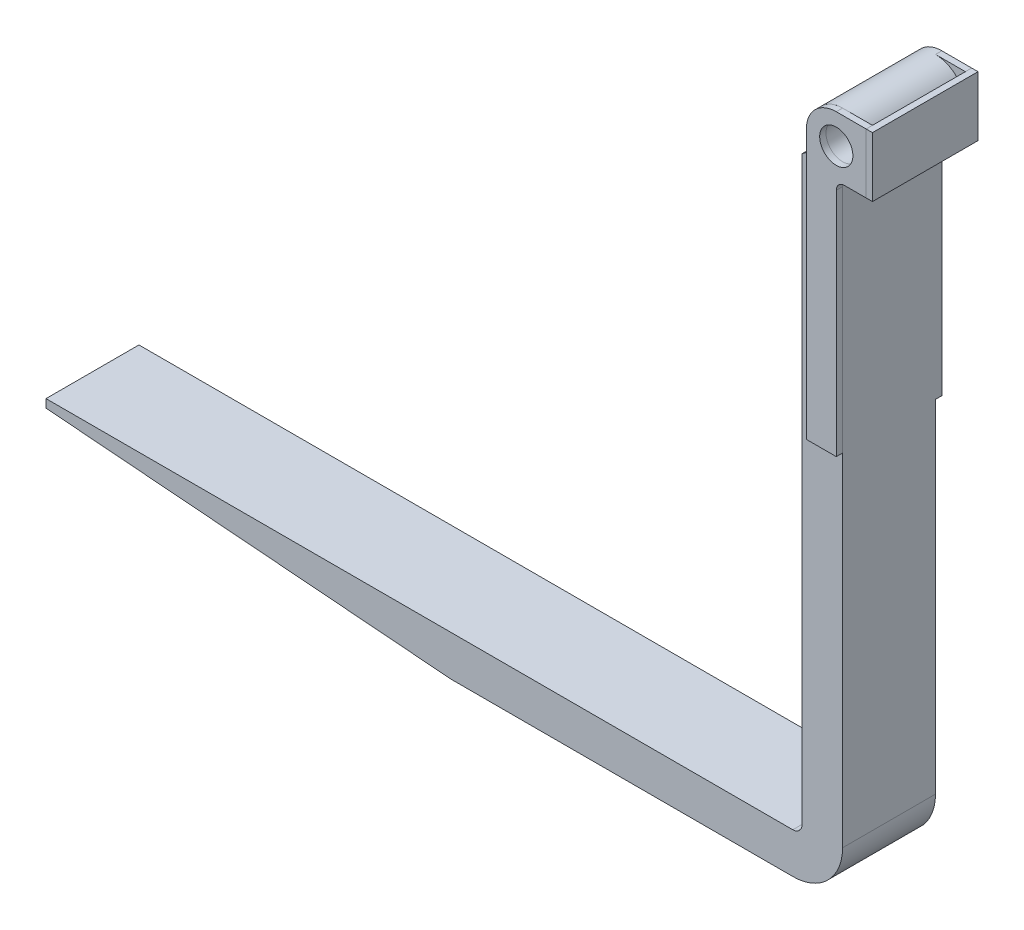
ISO-10303-21;
HEADER;
FILE_DESCRIPTION(('STEP AP214'),'2;1');
FILE_NAME('part.step','',(''),(''),'','','');
FILE_SCHEMA(('AUTOMOTIVE_DESIGN { 1 0 10303 214 1 1 1 1 }'));
ENDSEC;
DATA;
#1=APPLICATION_CONTEXT('core data for automotive mechanical design processes');
#2=APPLICATION_PROTOCOL_DEFINITION('international standard','automotive_design',2000,#1);
#3=PRODUCT_CONTEXT('',#1,'mechanical');
#4=PRODUCT('Part','Part','',(#3));
#5=PRODUCT_RELATED_PRODUCT_CATEGORY('part','',(#4));
#6=PRODUCT_DEFINITION_FORMATION('','',#4);
#7=PRODUCT_DEFINITION_CONTEXT('part definition',#1,'design');
#8=PRODUCT_DEFINITION('design','',#6,#7);
#9=PRODUCT_DEFINITION_SHAPE('','',#8);
#10=(LENGTH_UNIT() NAMED_UNIT(*) SI_UNIT(.MILLI.,.METRE.));
#11=(NAMED_UNIT(*) PLANE_ANGLE_UNIT() SI_UNIT($,.RADIAN.));
#12=(NAMED_UNIT(*) SI_UNIT($,.STERADIAN.) SOLID_ANGLE_UNIT());
#13=UNCERTAINTY_MEASURE_WITH_UNIT(LENGTH_MEASURE(1.E-05),#10,'distance_accuracy_value','');
#14=(GEOMETRIC_REPRESENTATION_CONTEXT(3) GLOBAL_UNCERTAINTY_ASSIGNED_CONTEXT((#13)) GLOBAL_UNIT_ASSIGNED_CONTEXT((#10,
#11,#12)) REPRESENTATION_CONTEXT('',''));
#15=CARTESIAN_POINT('',(0.,0.,0.));
#16=DIRECTION('',(0.,0.,1.));
#17=DIRECTION('',(1.,0.,0.));
#18=AXIS2_PLACEMENT_3D('',#15,#16,#17);
#19=CARTESIAN_POINT('',(54.5,950.,79.5));
#20=DIRECTION('',(0.,0.,-1.));
#21=DIRECTION('',(-1.,0.,0.));
#22=AXIS2_PLACEMENT_3D('',#19,#20,#21);
#23=PLANE('',#22);
#24=DIRECTION('',(0.,-1.,0.));
#25=VECTOR('',#24,1.);
#26=CARTESIAN_POINT('',(45.,950.,79.5));
#27=LINE('',#26,#25);
#28=CARTESIAN_POINT('',(45.,1040.,79.5));
#29=VERTEX_POINT('',#28);
#30=CARTESIAN_POINT('',(45.,950.,79.5));
#31=VERTEX_POINT('',#30);
#32=EDGE_CURVE('E117',#29,#31,#27,.T.);
#33=ORIENTED_EDGE('',*,*,#32,.T.);
#34=DIRECTION('',(-1.,0.,0.));
#35=VECTOR('',#34,1.);
#36=CARTESIAN_POINT('',(54.5,950.,79.5));
#37=LINE('',#36,#35);
#38=CARTESIAN_POINT('',(54.5,950.,79.5));
#39=VERTEX_POINT('',#38);
#40=EDGE_CURVE('E12',#39,#31,#37,.T.);
#41=ORIENTED_EDGE('',*,*,#40,.F.);
#42=DIRECTION('',(0.,-1.,0.));
#43=VECTOR('',#42,1.);
#44=CARTESIAN_POINT('',(54.5,950.,79.5));
#45=LINE('',#44,#43);
#46=CARTESIAN_POINT('',(54.5,1040.,79.5));
#47=VERTEX_POINT('',#46);
#48=EDGE_CURVE('E105',#47,#39,#45,.T.);
#49=ORIENTED_EDGE('',*,*,#48,.F.);
#50=DIRECTION('',(-1.,0.,0.));
#51=VECTOR('',#50,1.);
#52=CARTESIAN_POINT('',(54.5,1040.,79.5));
#53=LINE('',#52,#51);
#54=EDGE_CURVE('E113',#47,#29,#53,.T.);
#55=ORIENTED_EDGE('',*,*,#54,.T.);
#56=EDGE_LOOP('',(#33,#41,#49,#55));
#57=FACE_BOUND('',#56,.T.);
#58=ADVANCED_FACE('F54',(#57),#23,.F.);
#59=CARTESIAN_POINT('',(54.5,950.,79.5));
#60=DIRECTION('',(0.,1.,0.));
#61=DIRECTION('',(0.,0.,1.));
#62=AXIS2_PLACEMENT_3D('',#59,#60,#61);
#63=PLANE('',#62);
#64=DIRECTION('',(0.,0.,-1.));
#65=VECTOR('',#64,1.);
#66=CARTESIAN_POINT('',(45.,950.,79.5));
#67=LINE('',#66,#65);
#68=CARTESIAN_POINT('',(45.,950.,-79.5));
#69=VERTEX_POINT('',#68);
#70=EDGE_CURVE('E109',#31,#69,#67,.T.);
#71=ORIENTED_EDGE('',*,*,#70,.T.);
#72=DIRECTION('',(-1.,0.,0.));
#73=VECTOR('',#72,1.);
#74=CARTESIAN_POINT('',(54.5,950.,-79.5));
#75=LINE('',#74,#73);
#76=CARTESIAN_POINT('',(54.5,950.,-79.5));
#77=VERTEX_POINT('',#76);
#78=EDGE_CURVE('E62',#77,#69,#75,.T.);
#79=ORIENTED_EDGE('',*,*,#78,.F.);
#80=DIRECTION('',(0.,0.,-1.));
#81=VECTOR('',#80,1.);
#82=CARTESIAN_POINT('',(54.5,950.,79.5));
#83=LINE('',#82,#81);
#84=EDGE_CURVE('E100',#39,#77,#83,.T.);
#85=ORIENTED_EDGE('',*,*,#84,.F.);
#86=ORIENTED_EDGE('',*,*,#40,.T.);
#87=EDGE_LOOP('',(#71,#79,#85,#86));
#88=FACE_BOUND('',#87,.T.);
#89=ADVANCED_FACE('F108',(#88),#63,.F.);
#90=CARTESIAN_POINT('',(54.5,950.,-79.5));
#91=DIRECTION('',(0.,0.,1.));
#92=DIRECTION('',(1.,0.,0.));
#93=AXIS2_PLACEMENT_3D('',#90,#91,#92);
#94=PLANE('',#93);
#95=DIRECTION('',(0.,1.,0.));
#96=VECTOR('',#95,1.);
#97=CARTESIAN_POINT('',(45.,950.,-79.5));
#98=LINE('',#97,#96);
#99=CARTESIAN_POINT('',(45.,1040.,-79.5));
#100=VERTEX_POINT('',#99);
#101=EDGE_CURVE('E87',#69,#100,#98,.T.);
#102=ORIENTED_EDGE('',*,*,#101,.T.);
#103=DIRECTION('',(-1.,0.,0.));
#104=VECTOR('',#103,1.);
#105=CARTESIAN_POINT('',(54.5,1040.,-79.5));
#106=LINE('',#105,#104);
#107=CARTESIAN_POINT('',(54.5,1040.,-79.5));
#108=VERTEX_POINT('',#107);
#109=EDGE_CURVE('E110',#108,#100,#106,.T.);
#110=ORIENTED_EDGE('',*,*,#109,.F.);
#111=DIRECTION('',(0.,1.,0.));
#112=VECTOR('',#111,1.);
#113=CARTESIAN_POINT('',(54.5,950.,-79.5));
#114=LINE('',#113,#112);
#115=EDGE_CURVE('E103',#77,#108,#114,.T.);
#116=ORIENTED_EDGE('',*,*,#115,.F.);
#117=ORIENTED_EDGE('',*,*,#78,.T.);
#118=EDGE_LOOP('',(#102,#110,#116,#117));
#119=FACE_BOUND('',#118,.T.);
#120=ADVANCED_FACE('F111',(#119),#94,.F.);
#121=CARTESIAN_POINT('',(54.5,1040.,79.5));
#122=DIRECTION('',(0.,-1.,0.));
#123=DIRECTION('',(0.,0.,-1.));
#124=AXIS2_PLACEMENT_3D('',#121,#122,#123);
#125=PLANE('',#124);
#126=DIRECTION('',(0.,0.,1.));
#127=VECTOR('',#126,1.);
#128=CARTESIAN_POINT('',(45.,1040.,79.5));
#129=LINE('',#128,#127);
#130=EDGE_CURVE('E93',#100,#29,#129,.T.);
#131=ORIENTED_EDGE('',*,*,#130,.T.);
#132=ORIENTED_EDGE('',*,*,#54,.F.);
#133=DIRECTION('',(0.,0.,1.));
#134=VECTOR('',#133,1.);
#135=CARTESIAN_POINT('',(54.5,1040.,79.5));
#136=LINE('',#135,#134);
#137=EDGE_CURVE('E70',#108,#47,#136,.T.);
#138=ORIENTED_EDGE('',*,*,#137,.F.);
#139=ORIENTED_EDGE('',*,*,#109,.T.);
#140=EDGE_LOOP('',(#131,#132,#138,#139));
#141=FACE_BOUND('',#140,.T.);
#142=ADVANCED_FACE('F124',(#141),#125,.F.);
#143=CARTESIAN_POINT('',(54.5,0.,0.));
#144=DIRECTION('',(-1.,0.,0.));
#145=DIRECTION('',(0.,0.,1.));
#146=AXIS2_PLACEMENT_3D('',#143,#144,#145);
#147=PLANE('',#146);
#148=ORIENTED_EDGE('',*,*,#48,.T.);
#149=ORIENTED_EDGE('',*,*,#84,.T.);
#150=ORIENTED_EDGE('',*,*,#115,.T.);
#151=ORIENTED_EDGE('',*,*,#137,.T.);
#152=EDGE_LOOP('',(#148,#149,#150,#151));
#153=FACE_BOUND('',#152,.T.);
#154=ADVANCED_FACE('F101',(#153),#147,.F.);
#155=CARTESIAN_POINT('',(45.,0.,0.));
#156=DIRECTION('',(-1.,0.,0.));
#157=DIRECTION('',(0.,0.,1.));
#158=AXIS2_PLACEMENT_3D('',#155,#156,#157);
#159=PLANE('',#158);
#160=ORIENTED_EDGE('',*,*,#32,.F.);
#161=ORIENTED_EDGE('',*,*,#130,.F.);
#162=ORIENTED_EDGE('',*,*,#101,.F.);
#163=ORIENTED_EDGE('',*,*,#70,.F.);
#164=EDGE_LOOP('',(#160,#161,#162,#163));
#165=FACE_BOUND('',#164,.T.);
#166=ADVANCED_FACE('F127',(#165),#159,.T.);
#167=CLOSED_SHELL('',(#58,#89,#120,#142,#154,#166));
#168=MANIFOLD_SOLID_BREP('B2',#167);
#169=CARTESIAN_POINT('',(0.,995.,79.5));
#170=DIRECTION('',(0.,0.,-1.));
#171=DIRECTION('',(-1.,0.,0.));
#172=AXIS2_PLACEMENT_3D('',#169,#170,#171);
#173=CYLINDRICAL_SURFACE('',#172,45.);
#174=CARTESIAN_POINT('',(0.,995.,70.));
#175=DIRECTION('',(0.,0.,1.));
#176=DIRECTION('',(1.,0.,0.));
#177=AXIS2_PLACEMENT_3D('',#174,#175,#176);
#178=CIRCLE('',#177,45.);
#179=CARTESIAN_POINT('',(0.,1040.,70.));
#180=VERTEX_POINT('',#179);
#181=CARTESIAN_POINT('',(-45.,995.,70.));
#182=VERTEX_POINT('',#181);
#183=EDGE_CURVE('E299',#180,#182,#178,.T.);
#184=ORIENTED_EDGE('',*,*,#183,.T.);
#185=DIRECTION('',(0.,0.,-1.));
#186=VECTOR('',#185,1.);
#187=CARTESIAN_POINT('',(-45.,995.,79.5));
#188=LINE('',#187,#186);
#189=CARTESIAN_POINT('',(-45.,995.,79.5));
#190=VERTEX_POINT('',#189);
#191=EDGE_CURVE('E52',#190,#182,#188,.T.);
#192=ORIENTED_EDGE('',*,*,#191,.F.);
#193=CARTESIAN_POINT('',(0.,995.,79.5));
#194=DIRECTION('',(0.,0.,1.));
#195=DIRECTION('',(1.,0.,0.));
#196=AXIS2_PLACEMENT_3D('',#193,#194,#195);
#197=CIRCLE('',#196,45.);
#198=CARTESIAN_POINT('',(0.,1040.,79.5));
#199=VERTEX_POINT('',#198);
#200=EDGE_CURVE('E345',#199,#190,#197,.T.);
#201=ORIENTED_EDGE('',*,*,#200,.F.);
#202=DIRECTION('',(0.,0.,-1.));
#203=VECTOR('',#202,1.);
#204=CARTESIAN_POINT('',(0.,1040.,79.5));
#205=LINE('',#204,#203);
#206=EDGE_CURVE('E292',#199,#180,#205,.T.);
#207=ORIENTED_EDGE('',*,*,#206,.T.);
#208=EDGE_LOOP('',(#184,#192,#201,#207));
#209=FACE_BOUND('',#208,.T.);
#210=ADVANCED_FACE('F199',(#209),#173,.T.);
#211=CARTESIAN_POINT('',(-44.9999999999998,0.,79.5));
#212=DIRECTION('',(1.,0.,0.));
#213=DIRECTION('',(0.,1.,0.));
#214=AXIS2_PLACEMENT_3D('',#211,#212,#213);
#215=PLANE('',#214);
#216=DIRECTION('',(0.,-1.,0.));
#217=VECTOR('',#216,1.);
#218=CARTESIAN_POINT('',(-44.9999999999998,0.,70.));
#219=LINE('',#218,#217);
#220=CARTESIAN_POINT('',(-44.9999999999999,590.,70.));
#221=VERTEX_POINT('',#220);
#222=EDGE_CURVE('E302',#182,#221,#219,.T.);
#223=ORIENTED_EDGE('',*,*,#222,.T.);
#224=DIRECTION('',(0.,0.,-1.));
#225=VECTOR('',#224,1.);
#226=CARTESIAN_POINT('',(-44.9999999999999,590.,79.5));
#227=LINE('',#226,#225);
#228=CARTESIAN_POINT('',(-44.9999999999999,590.,79.5));
#229=VERTEX_POINT('',#228);
#230=EDGE_CURVE('E208',#229,#221,#227,.T.);
#231=ORIENTED_EDGE('',*,*,#230,.F.);
#232=DIRECTION('',(0.,-1.,0.));
#233=VECTOR('',#232,1.);
#234=CARTESIAN_POINT('',(-44.9999999999998,0.,79.5));
#235=LINE('',#234,#233);
#236=EDGE_CURVE('E259',#190,#229,#235,.T.);
#237=ORIENTED_EDGE('',*,*,#236,.F.);
#238=ORIENTED_EDGE('',*,*,#191,.T.);
#239=EDGE_LOOP('',(#223,#231,#237,#238));
#240=FACE_BOUND('',#239,.T.);
#241=ADVANCED_FACE('F364',(#240),#215,.F.);
#242=CARTESIAN_POINT('',(0.,590.,79.5));
#243=DIRECTION('',(0.,1.,0.));
#244=DIRECTION('',(0.,0.,1.));
#245=AXIS2_PLACEMENT_3D('',#242,#243,#244);
#246=PLANE('',#245);
#247=DIRECTION('',(1.,0.,0.));
#248=VECTOR('',#247,1.);
#249=CARTESIAN_POINT('',(0.,590.,70.));
#250=LINE('',#249,#248);
#251=CARTESIAN_POINT('',(0.,590.,70.));
#252=VERTEX_POINT('',#251);
#253=EDGE_CURVE('E304',#221,#252,#250,.T.);
#254=ORIENTED_EDGE('',*,*,#253,.T.);
#255=DIRECTION('',(0.,0.,-1.));
#256=VECTOR('',#255,1.);
#257=CARTESIAN_POINT('',(0.,590.,79.5));
#258=LINE('',#257,#256);
#259=CARTESIAN_POINT('',(0.,590.,79.5));
#260=VERTEX_POINT('',#259);
#261=EDGE_CURVE('E320',#260,#252,#258,.T.);
#262=ORIENTED_EDGE('',*,*,#261,.F.);
#263=DIRECTION('',(1.,0.,0.));
#264=VECTOR('',#263,1.);
#265=CARTESIAN_POINT('',(0.,590.,79.5));
#266=LINE('',#265,#264);
#267=EDGE_CURVE('E328',#229,#260,#266,.T.);
#268=ORIENTED_EDGE('',*,*,#267,.F.);
#269=ORIENTED_EDGE('',*,*,#230,.T.);
#270=EDGE_LOOP('',(#254,#262,#268,#269));
#271=FACE_BOUND('',#270,.T.);
#272=ADVANCED_FACE('F326',(#271),#246,.F.);
#273=CARTESIAN_POINT('',(0.,0.,79.5));
#274=DIRECTION('',(-1.,0.,0.));
#275=DIRECTION('',(0.,0.,1.));
#276=AXIS2_PLACEMENT_3D('',#273,#274,#275);
#277=PLANE('',#276);
#278=DIRECTION('',(0.,1.,0.));
#279=VECTOR('',#278,1.);
#280=CARTESIAN_POINT('',(0.,0.,70.));
#281=LINE('',#280,#279);
#282=CARTESIAN_POINT('',(0.,937.5,70.));
#283=VERTEX_POINT('',#282);
#284=EDGE_CURVE('E306',#252,#283,#281,.T.);
#285=ORIENTED_EDGE('',*,*,#284,.T.);
#286=DIRECTION('',(0.,0.,-1.));
#287=VECTOR('',#286,1.);
#288=CARTESIAN_POINT('',(0.,937.5,79.5));
#289=LINE('',#288,#287);
#290=CARTESIAN_POINT('',(0.,937.5,79.5));
#291=VERTEX_POINT('',#290);
#292=EDGE_CURVE('E317',#291,#283,#289,.T.);
#293=ORIENTED_EDGE('',*,*,#292,.F.);
#294=DIRECTION('',(0.,1.,0.));
#295=VECTOR('',#294,1.);
#296=CARTESIAN_POINT('',(0.,0.,79.5));
#297=LINE('',#296,#295);
#298=EDGE_CURVE('E340',#260,#291,#297,.T.);
#299=ORIENTED_EDGE('',*,*,#298,.F.);
#300=ORIENTED_EDGE('',*,*,#261,.T.);
#301=EDGE_LOOP('',(#285,#293,#299,#300));
#302=FACE_BOUND('',#301,.T.);
#303=ADVANCED_FACE('F336',(#302),#277,.F.);
#304=CARTESIAN_POINT('',(12.5,937.5,79.5));
#305=DIRECTION('',(0.,0.,-1.));
#306=DIRECTION('',(-1.,0.,0.));
#307=AXIS2_PLACEMENT_3D('',#304,#305,#306);
#308=CYLINDRICAL_SURFACE('',#307,12.5);
#309=CARTESIAN_POINT('',(12.5,937.5,70.));
#310=DIRECTION('',(0.,0.,1.));
#311=DIRECTION('',(1.,0.,0.));
#312=AXIS2_PLACEMENT_3D('',#309,#310,#311);
#313=CIRCLE('',#312,12.5);
#314=CARTESIAN_POINT('',(12.5000000000001,950.,70.));
#315=VERTEX_POINT('',#314);
#316=EDGE_CURVE('E308',#283,#315,#313,.F.);
#317=ORIENTED_EDGE('',*,*,#316,.T.);
#318=DIRECTION('',(0.,0.,-1.));
#319=VECTOR('',#318,1.);
#320=CARTESIAN_POINT('',(12.5000000000001,950.,79.5));
#321=LINE('',#320,#319);
#322=CARTESIAN_POINT('',(12.5000000000001,950.,79.5));
#323=VERTEX_POINT('',#322);
#324=EDGE_CURVE('E287',#323,#315,#321,.T.);
#325=ORIENTED_EDGE('',*,*,#324,.F.);
#326=CARTESIAN_POINT('',(12.5,937.5,79.5));
#327=DIRECTION('',(0.,0.,1.));
#328=DIRECTION('',(1.,0.,0.));
#329=AXIS2_PLACEMENT_3D('',#326,#327,#328);
#330=CIRCLE('',#329,12.5);
#331=EDGE_CURVE('E278',#291,#323,#330,.F.);
#332=ORIENTED_EDGE('',*,*,#331,.F.);
#333=ORIENTED_EDGE('',*,*,#292,.T.);
#334=EDGE_LOOP('',(#317,#325,#332,#333));
#335=FACE_BOUND('',#334,.T.);
#336=ADVANCED_FACE('F339',(#335),#308,.F.);
#337=CARTESIAN_POINT('',(0.,950.,79.5));
#338=DIRECTION('',(0.,1.,0.));
#339=DIRECTION('',(0.,0.,1.));
#340=AXIS2_PLACEMENT_3D('',#337,#338,#339);
#341=PLANE('',#340);
#342=DIRECTION('',(1.,0.,0.));
#343=VECTOR('',#342,1.);
#344=CARTESIAN_POINT('',(0.,950.,70.));
#345=LINE('',#344,#343);
#346=CARTESIAN_POINT('',(45.,950.,70.));
#347=VERTEX_POINT('',#346);
#348=EDGE_CURVE('E286',#315,#347,#345,.T.);
#349=ORIENTED_EDGE('',*,*,#348,.T.);
#350=DIRECTION('',(0.,0.,-1.));
#351=VECTOR('',#350,1.);
#352=CARTESIAN_POINT('',(45.,950.,79.5));
#353=LINE('',#352,#351);
#354=CARTESIAN_POINT('',(45.,950.,79.5));
#355=VERTEX_POINT('',#354);
#356=EDGE_CURVE('E283',#355,#347,#353,.T.);
#357=ORIENTED_EDGE('',*,*,#356,.F.);
#358=DIRECTION('',(1.,0.,0.));
#359=VECTOR('',#358,1.);
#360=CARTESIAN_POINT('',(0.,950.,79.5));
#361=LINE('',#360,#359);
#362=EDGE_CURVE('E272',#323,#355,#361,.T.);
#363=ORIENTED_EDGE('',*,*,#362,.F.);
#364=ORIENTED_EDGE('',*,*,#324,.T.);
#365=EDGE_LOOP('',(#349,#357,#363,#364));
#366=FACE_BOUND('',#365,.T.);
#367=ADVANCED_FACE('F284',(#366),#341,.F.);
#368=CARTESIAN_POINT('',(45.,0.,79.5));
#369=DIRECTION('',(-1.,0.,0.));
#370=DIRECTION('',(0.,0.,1.));
#371=AXIS2_PLACEMENT_3D('',#368,#369,#370);
#372=PLANE('',#371);
#373=DIRECTION('',(0.,1.,0.));
#374=VECTOR('',#373,1.);
#375=CARTESIAN_POINT('',(45.,0.,70.));
#376=LINE('',#375,#374);
#377=CARTESIAN_POINT('',(45.,1040.,70.));
#378=VERTEX_POINT('',#377);
#379=EDGE_CURVE('E245',#347,#378,#376,.T.);
#380=ORIENTED_EDGE('',*,*,#379,.T.);
#381=DIRECTION('',(0.,0.,-1.));
#382=VECTOR('',#381,1.);
#383=CARTESIAN_POINT('',(45.,1040.,79.5));
#384=LINE('',#383,#382);
#385=CARTESIAN_POINT('',(45.,1040.,79.5));
#386=VERTEX_POINT('',#385);
#387=EDGE_CURVE('E288',#386,#378,#384,.T.);
#388=ORIENTED_EDGE('',*,*,#387,.F.);
#389=DIRECTION('',(0.,1.,0.));
#390=VECTOR('',#389,1.);
#391=CARTESIAN_POINT('',(45.,0.,79.5));
#392=LINE('',#391,#390);
#393=EDGE_CURVE('E276',#355,#386,#392,.T.);
#394=ORIENTED_EDGE('',*,*,#393,.F.);
#395=ORIENTED_EDGE('',*,*,#356,.T.);
#396=EDGE_LOOP('',(#380,#388,#394,#395));
#397=FACE_BOUND('',#396,.T.);
#398=ADVANCED_FACE('F290',(#397),#372,.F.);
#399=CARTESIAN_POINT('',(0.,995.,79.5));
#400=DIRECTION('',(0.,0.,-1.));
#401=DIRECTION('',(-1.,0.,0.));
#402=AXIS2_PLACEMENT_3D('',#399,#400,#401);
#403=CYLINDRICAL_SURFACE('',#402,25.);
#404=CARTESIAN_POINT('',(0.,995.,79.5));
#405=DIRECTION('',(0.,0.,1.));
#406=DIRECTION('',(1.,0.,0.));
#407=AXIS2_PLACEMENT_3D('',#404,#405,#406);
#408=CIRCLE('',#407,25.);
#409=CARTESIAN_POINT('',(25.,995.,79.5));
#410=VERTEX_POINT('',#409);
#411=EDGE_CURVE('E313',#410,#410,#408,.F.);
#412=ORIENTED_EDGE('',*,*,#411,.F.);
#413=EDGE_LOOP('',(#412));
#414=FACE_BOUND('',#413,.T.);
#415=CARTESIAN_POINT('',(0.,995.,70.));
#416=DIRECTION('',(0.,0.,1.));
#417=DIRECTION('',(1.,0.,0.));
#418=AXIS2_PLACEMENT_3D('',#415,#416,#417);
#419=CIRCLE('',#418,25.);
#420=CARTESIAN_POINT('',(25.,995.,70.));
#421=VERTEX_POINT('',#420);
#422=EDGE_CURVE('E296',#421,#421,#419,.F.);
#423=ORIENTED_EDGE('',*,*,#422,.T.);
#424=EDGE_LOOP('',(#423));
#425=FACE_BOUND('',#424,.T.);
#426=ADVANCED_FACE('F201',(#414,#425),#403,.F.);
#427=CARTESIAN_POINT('',(0.,1040.,79.5));
#428=DIRECTION('',(0.,-1.,0.));
#429=DIRECTION('',(0.,0.,-1.));
#430=AXIS2_PLACEMENT_3D('',#427,#428,#429);
#431=PLANE('',#430);
#432=DIRECTION('',(-1.,0.,0.));
#433=VECTOR('',#432,1.);
#434=CARTESIAN_POINT('',(0.,1040.,70.));
#435=LINE('',#434,#433);
#436=EDGE_CURVE('E251',#378,#180,#435,.T.);
#437=ORIENTED_EDGE('',*,*,#436,.T.);
#438=ORIENTED_EDGE('',*,*,#206,.F.);
#439=DIRECTION('',(-1.,0.,0.));
#440=VECTOR('',#439,1.);
#441=CARTESIAN_POINT('',(0.,1040.,79.5));
#442=LINE('',#441,#440);
#443=EDGE_CURVE('E216',#386,#199,#442,.T.);
#444=ORIENTED_EDGE('',*,*,#443,.F.);
#445=ORIENTED_EDGE('',*,*,#387,.T.);
#446=EDGE_LOOP('',(#437,#438,#444,#445));
#447=FACE_BOUND('',#446,.T.);
#448=ADVANCED_FACE('F353',(#447),#431,.F.);
#449=CARTESIAN_POINT('',(0.,0.,79.5));
#450=DIRECTION('',(0.,0.,1.));
#451=DIRECTION('',(1.,0.,0.));
#452=AXIS2_PLACEMENT_3D('',#449,#450,#451);
#453=PLANE('',#452);
#454=ORIENTED_EDGE('',*,*,#411,.T.);
#455=EDGE_LOOP('',(#454));
#456=FACE_BOUND('',#455,.T.);
#457=ORIENTED_EDGE('',*,*,#200,.T.);
#458=ORIENTED_EDGE('',*,*,#236,.T.);
#459=ORIENTED_EDGE('',*,*,#267,.T.);
#460=ORIENTED_EDGE('',*,*,#298,.T.);
#461=ORIENTED_EDGE('',*,*,#331,.T.);
#462=ORIENTED_EDGE('',*,*,#362,.T.);
#463=ORIENTED_EDGE('',*,*,#393,.T.);
#464=ORIENTED_EDGE('',*,*,#443,.T.);
#465=EDGE_LOOP('',(#457,#458,#459,#460,#461,#462,#463,#464));
#466=FACE_BOUND('',#465,.T.);
#467=ADVANCED_FACE('F274',(#456,#466),#453,.T.);
#468=CARTESIAN_POINT('',(0.,0.,70.));
#469=DIRECTION('',(0.,0.,1.));
#470=DIRECTION('',(1.,0.,0.));
#471=AXIS2_PLACEMENT_3D('',#468,#469,#470);
#472=PLANE('',#471);
#473=ORIENTED_EDGE('',*,*,#422,.F.);
#474=EDGE_LOOP('',(#473));
#475=FACE_BOUND('',#474,.T.);
#476=ORIENTED_EDGE('',*,*,#183,.F.);
#477=ORIENTED_EDGE('',*,*,#436,.F.);
#478=ORIENTED_EDGE('',*,*,#379,.F.);
#479=ORIENTED_EDGE('',*,*,#348,.F.);
#480=ORIENTED_EDGE('',*,*,#316,.F.);
#481=ORIENTED_EDGE('',*,*,#284,.F.);
#482=ORIENTED_EDGE('',*,*,#253,.F.);
#483=ORIENTED_EDGE('',*,*,#222,.F.);
#484=EDGE_LOOP('',(#476,#477,#478,#479,#480,#481,#482,#483));
#485=FACE_BOUND('',#484,.T.);
#486=ADVANCED_FACE('F332',(#475,#485),#472,.F.);
#487=CLOSED_SHELL('',(#210,#241,#272,#303,#336,#367,#398,#426,#448,#467,#486));
#488=MANIFOLD_SOLID_BREP('B6',#487);
#489=CARTESIAN_POINT('',(0.,0.,-70.));
#490=DIRECTION('',(0.,0.,-1.));
#491=DIRECTION('',(1.,0.,0.));
#492=AXIS2_PLACEMENT_3D('',#489,#490,#491);
#493=PLANE('',#492);
#494=CARTESIAN_POINT('',(0.,995.,-70.));
#495=DIRECTION('',(0.,0.,1.));
#496=DIRECTION('',(1.,0.,0.));
#497=AXIS2_PLACEMENT_3D('',#494,#495,#496);
#498=CIRCLE('',#497,45.);
#499=CARTESIAN_POINT('',(0.,950.,-70.));
#500=VERTEX_POINT('',#499);
#501=CARTESIAN_POINT('',(45.,995.,-70.));
#502=VERTEX_POINT('',#501);
#503=EDGE_CURVE('E508',#500,#502,#498,.T.);
#504=ORIENTED_EDGE('',*,*,#503,.F.);
#505=DIRECTION('',(0.,-1.,0.));
#506=VECTOR('',#505,1.);
#507=CARTESIAN_POINT('',(0.,75.0000000000005,-70.));
#508=LINE('',#507,#506);
#509=CARTESIAN_POINT('',(0.,937.5,-70.));
#510=VERTEX_POINT('',#509);
#511=EDGE_CURVE('E663',#500,#510,#508,.T.);
#512=ORIENTED_EDGE('',*,*,#511,.T.);
#513=CARTESIAN_POINT('',(12.5,937.5,-70.));
#514=DIRECTION('',(0.,0.,1.));
#515=DIRECTION('',(1.,0.,0.));
#516=AXIS2_PLACEMENT_3D('',#513,#514,#515);
#517=CIRCLE('',#516,12.5);
#518=CARTESIAN_POINT('',(12.5000000000001,950.,-70.));
#519=VERTEX_POINT('',#518);
#520=EDGE_CURVE('E718',#510,#519,#517,.F.);
#521=ORIENTED_EDGE('',*,*,#520,.T.);
#522=DIRECTION('',(1.,0.,0.));
#523=VECTOR('',#522,1.);
#524=CARTESIAN_POINT('',(0.,950.,-70.));
#525=LINE('',#524,#523);
#526=CARTESIAN_POINT('',(45.,950.,-70.));
#527=VERTEX_POINT('',#526);
#528=EDGE_CURVE('E727',#519,#527,#525,.T.);
#529=ORIENTED_EDGE('',*,*,#528,.T.);
#530=DIRECTION('',(0.,1.,0.));
#531=VECTOR('',#530,1.);
#532=CARTESIAN_POINT('',(45.,0.,-70.));
#533=LINE('',#532,#531);
#534=EDGE_CURVE('E737',#527,#502,#533,.T.);
#535=ORIENTED_EDGE('',*,*,#534,.T.);
#536=EDGE_LOOP('',(#504,#512,#521,#529,#535));
#537=FACE_BOUND('',#536,.T.);
#538=ADVANCED_FACE('F485',(#537),#493,.F.);
#539=CARTESIAN_POINT('',(0.,995.,70.));
#540=DIRECTION('',(0.,0.,1.));
#541=DIRECTION('',(1.,0.,0.));
#542=AXIS2_PLACEMENT_3D('',#539,#540,#541);
#543=PLANE('',#542);
#544=CARTESIAN_POINT('',(0.,995.,70.));
#545=DIRECTION('',(0.,0.,1.));
#546=DIRECTION('',(1.,0.,0.));
#547=AXIS2_PLACEMENT_3D('',#544,#545,#546);
#548=CIRCLE('',#547,45.);
#549=CARTESIAN_POINT('',(0.,950.,70.));
#550=VERTEX_POINT('',#549);
#551=CARTESIAN_POINT('',(-36.2125858627835,968.28579731434,70.));
#552=VERTEX_POINT('',#551);
#553=EDGE_CURVE('E197',#550,#552,#548,.T.);
#554=ORIENTED_EDGE('',*,*,#553,.T.);
#555=DIRECTION('',(0.804724130284077,0.593648948570227,0.));
#556=VECTOR('',#555,1.);
#557=CARTESIAN_POINT('',(-475.335015663072,644.343021232156,70.));
#558=LINE('',#557,#556);
#559=CARTESIAN_POINT('',(-61.,950.,70.));
#560=VERTEX_POINT('',#559);
#561=EDGE_CURVE('E617',#560,#552,#558,.T.);
#562=ORIENTED_EDGE('',*,*,#561,.F.);
#563=DIRECTION('',(0.,1.,0.));
#564=VECTOR('',#563,1.);
#565=CARTESIAN_POINT('',(-61.,75.0000000000005,70.));
#566=LINE('',#565,#564);
#567=CARTESIAN_POINT('',(-61.,75.0000000000001,70.));
#568=VERTEX_POINT('',#567);
#569=EDGE_CURVE('E641',#560,#568,#566,.F.);
#570=ORIENTED_EDGE('',*,*,#569,.T.);
#571=CARTESIAN_POINT('',(-75.,75.,70.));
#572=DIRECTION('',(0.,0.,1.));
#573=DIRECTION('',(1.,0.,0.));
#574=AXIS2_PLACEMENT_3D('',#571,#572,#573);
#575=CIRCLE('',#574,14.);
#576=CARTESIAN_POINT('',(-75.0000000000005,61.,70.));
#577=VERTEX_POINT('',#576);
#578=EDGE_CURVE('E643',#568,#577,#575,.F.);
#579=ORIENTED_EDGE('',*,*,#578,.T.);
#580=DIRECTION('',(1.,0.,0.));
#581=VECTOR('',#580,1.);
#582=CARTESIAN_POINT('',(-75.0000000000005,61.,70.));
#583=LINE('',#582,#581);
#584=CARTESIAN_POINT('',(-1200.,61.,70.));
#585=VERTEX_POINT('',#584);
#586=EDGE_CURVE('E669',#577,#585,#583,.F.);
#587=ORIENTED_EDGE('',*,*,#586,.T.);
#588=DIRECTION('',(0.,1.,0.));
#589=VECTOR('',#588,1.);
#590=CARTESIAN_POINT('',(-1200.,0.,70.));
#591=LINE('',#590,#589);
#592=CARTESIAN_POINT('',(-1200.,48.5,70.));
#593=VERTEX_POINT('',#592);
#594=EDGE_CURVE('E790',#593,#585,#591,.T.);
#595=ORIENTED_EDGE('',*,*,#594,.F.);
#596=DIRECTION('',(0.996854130580606,-0.0792580743166547,0.));
#597=VECTOR('',#596,1.);
#598=CARTESIAN_POINT('',(-84.1608042146896,-40.2183622878485,70.));
#599=LINE('',#598,#597);
#600=CARTESIAN_POINT('',(-590.,0.,70.));
#601=VERTEX_POINT('',#600);
#602=EDGE_CURVE('E655',#593,#601,#599,.T.);
#603=ORIENTED_EDGE('',*,*,#602,.T.);
#604=DIRECTION('',(-1.,0.,0.));
#605=VECTOR('',#604,1.);
#606=CARTESIAN_POINT('',(-75.0000000000005,0.,70.));
#607=LINE('',#606,#605);
#608=CARTESIAN_POINT('',(-75.0000000000005,0.,70.));
#609=VERTEX_POINT('',#608);
#610=EDGE_CURVE('E645',#609,#601,#607,.T.);
#611=ORIENTED_EDGE('',*,*,#610,.F.);
#612=CARTESIAN_POINT('',(-75.,75.,70.));
#613=DIRECTION('',(0.,0.,-1.));
#614=DIRECTION('',(-1.,0.,0.));
#615=AXIS2_PLACEMENT_3D('',#612,#613,#614);
#616=CIRCLE('',#615,75.);
#617=CARTESIAN_POINT('',(0.,75.0000000000005,70.));
#618=VERTEX_POINT('',#617);
#619=EDGE_CURVE('E638',#618,#609,#616,.T.);
#620=ORIENTED_EDGE('',*,*,#619,.F.);
#621=DIRECTION('',(0.,-1.,0.));
#622=VECTOR('',#621,1.);
#623=CARTESIAN_POINT('',(0.,75.0000000000005,70.));
#624=LINE('',#623,#622);
#625=EDGE_CURVE('E635',#550,#618,#624,.T.);
#626=ORIENTED_EDGE('',*,*,#625,.F.);
#627=EDGE_LOOP('',(#554,#562,#570,#579,#587,#595,#603,#611,#620,#626));
#628=FACE_BOUND('',#627,.T.);
#629=CARTESIAN_POINT('',(0.,995.,70.));
#630=DIRECTION('',(0.,0.,1.));
#631=DIRECTION('',(1.,0.,0.));
#632=AXIS2_PLACEMENT_3D('',#629,#630,#631);
#633=CIRCLE('',#632,25.);
#634=CARTESIAN_POINT('',(25.,995.,70.));
#635=VERTEX_POINT('',#634);
#636=EDGE_CURVE('E752',#635,#635,#633,.T.);
#637=ORIENTED_EDGE('',*,*,#636,.F.);
#638=EDGE_LOOP('',(#637));
#639=FACE_BOUND('',#638,.T.);
#640=ADVANCED_FACE('F631',(#628,#639),#543,.T.);
#641=CARTESIAN_POINT('',(0.,995.,70.));
#642=DIRECTION('',(0.,0.,-1.));
#643=DIRECTION('',(-1.,0.,0.));
#644=AXIS2_PLACEMENT_3D('',#641,#642,#643);
#645=CYLINDRICAL_SURFACE('',#644,45.);
#646=DIRECTION('',(0.,0.,1.));
#647=VECTOR('',#646,1.);
#648=CARTESIAN_POINT('',(-45.,995.,-79.5));
#649=LINE('',#648,#647);
#650=CARTESIAN_POINT('',(-45.,995.,-79.5));
#651=VERTEX_POINT('',#650);
#652=CARTESIAN_POINT('',(-45.,995.,-70.));
#653=VERTEX_POINT('',#652);
#654=EDGE_CURVE('E689',#651,#653,#649,.T.);
#655=ORIENTED_EDGE('',*,*,#654,.T.);
#656=CARTESIAN_POINT('',(-36.2125858627836,968.28579731434,-70.));
#657=VERTEX_POINT('',#656);
#658=EDGE_CURVE('E627',#653,#657,#498,.T.);
#659=ORIENTED_EDGE('',*,*,#658,.T.);
#660=DIRECTION('',(0.,0.,-1.));
#661=VECTOR('',#660,1.);
#662=CARTESIAN_POINT('',(-36.2125858627835,968.28579731434,70.));
#663=LINE('',#662,#661);
#664=EDGE_CURVE('E500',#552,#657,#663,.T.);
#665=ORIENTED_EDGE('',*,*,#664,.F.);
#666=ORIENTED_EDGE('',*,*,#553,.F.);
#667=DIRECTION('',(0.,0.,-1.));
#668=VECTOR('',#667,1.);
#669=CARTESIAN_POINT('',(0.,950.,70.));
#670=LINE('',#669,#668);
#671=EDGE_CURVE('E676',#550,#500,#670,.T.);
#672=ORIENTED_EDGE('',*,*,#671,.T.);
#673=ORIENTED_EDGE('',*,*,#503,.T.);
#674=CARTESIAN_POINT('',(0.,1040.,-70.));
#675=VERTEX_POINT('',#674);
#676=EDGE_CURVE('E489',#502,#675,#498,.T.);
#677=ORIENTED_EDGE('',*,*,#676,.T.);
#678=DIRECTION('',(0.,0.,1.));
#679=VECTOR('',#678,1.);
#680=CARTESIAN_POINT('',(0.,1040.,-79.5));
#681=LINE('',#680,#679);
#682=CARTESIAN_POINT('',(0.,1040.,-79.5));
#683=VERTEX_POINT('',#682);
#684=EDGE_CURVE('E694',#683,#675,#681,.T.);
#685=ORIENTED_EDGE('',*,*,#684,.F.);
#686=CARTESIAN_POINT('',(0.,995.,-79.5));
#687=DIRECTION('',(0.,0.,1.));
#688=DIRECTION('',(1.,0.,0.));
#689=AXIS2_PLACEMENT_3D('',#686,#687,#688);
#690=CIRCLE('',#689,45.);
#691=EDGE_CURVE('E691',#683,#651,#690,.T.);
#692=ORIENTED_EDGE('',*,*,#691,.T.);
#693=EDGE_LOOP('',(#655,#659,#665,#666,#672,#673,#677,#685,#692));
#694=FACE_BOUND('',#693,.T.);
#695=ADVANCED_FACE('F487',(#694),#645,.T.);
#696=CARTESIAN_POINT('',(0.,995.,70.));
#697=DIRECTION('',(0.,0.,-1.));
#698=DIRECTION('',(-1.,0.,0.));
#699=AXIS2_PLACEMENT_3D('',#696,#697,#698);
#700=CYLINDRICAL_SURFACE('',#699,25.);
#701=CARTESIAN_POINT('',(0.,995.,-79.5));
#702=DIRECTION('',(0.,0.,1.));
#703=DIRECTION('',(1.,0.,0.));
#704=AXIS2_PLACEMENT_3D('',#701,#702,#703);
#705=CIRCLE('',#704,25.);
#706=CARTESIAN_POINT('',(25.,995.,-79.5));
#707=VERTEX_POINT('',#706);
#708=EDGE_CURVE('E745',#707,#707,#705,.F.);
#709=ORIENTED_EDGE('',*,*,#708,.T.);
#710=EDGE_LOOP('',(#709));
#711=FACE_BOUND('',#710,.T.);
#712=ORIENTED_EDGE('',*,*,#636,.T.);
#713=EDGE_LOOP('',(#712));
#714=FACE_BOUND('',#713,.T.);
#715=ADVANCED_FACE('F838',(#711,#714),#700,.F.);
#716=ORIENTED_EDGE('',*,*,#676,.F.);
#717=CARTESIAN_POINT('',(45.,1040.,-70.));
#718=VERTEX_POINT('',#717);
#719=EDGE_CURVE('E736',#502,#718,#533,.T.);
#720=ORIENTED_EDGE('',*,*,#719,.T.);
#721=DIRECTION('',(-1.,0.,0.));
#722=VECTOR('',#721,1.);
#723=CARTESIAN_POINT('',(0.,1040.,-70.));
#724=LINE('',#723,#722);
#725=EDGE_CURVE('E748',#718,#675,#724,.T.);
#726=ORIENTED_EDGE('',*,*,#725,.T.);
#727=EDGE_LOOP('',(#716,#720,#726));
#728=FACE_BOUND('',#727,.T.);
#729=ADVANCED_FACE('F759',(#728),#493,.F.);
#730=CARTESIAN_POINT('',(-44.9999999999998,0.,-79.5));
#731=DIRECTION('',(1.,0.,0.));
#732=DIRECTION('',(0.,1.,0.));
#733=AXIS2_PLACEMENT_3D('',#730,#731,#732);
#734=PLANE('',#733);
#735=DIRECTION('',(0.,-1.,0.));
#736=VECTOR('',#735,1.);
#737=CARTESIAN_POINT('',(-44.9999999999998,0.,-70.));
#738=LINE('',#737,#736);
#739=CARTESIAN_POINT('',(-45.,961.803278688524,-70.));
#740=VERTEX_POINT('',#739);
#741=EDGE_CURVE('E697',#653,#740,#738,.T.);
#742=ORIENTED_EDGE('',*,*,#741,.F.);
#743=ORIENTED_EDGE('',*,*,#654,.F.);
#744=DIRECTION('',(0.,-1.,0.));
#745=VECTOR('',#744,1.);
#746=CARTESIAN_POINT('',(-44.9999999999998,0.,-79.5));
#747=LINE('',#746,#745);
#748=CARTESIAN_POINT('',(-44.9999999999999,590.,-79.5));
#749=VERTEX_POINT('',#748);
#750=EDGE_CURVE('E703',#651,#749,#747,.T.);
#751=ORIENTED_EDGE('',*,*,#750,.T.);
#752=DIRECTION('',(0.,0.,1.));
#753=VECTOR('',#752,1.);
#754=CARTESIAN_POINT('',(-44.9999999999999,590.,-79.5));
#755=LINE('',#754,#753);
#756=CARTESIAN_POINT('',(-44.9999999999999,590.,-70.));
#757=VERTEX_POINT('',#756);
#758=EDGE_CURVE('E700',#749,#757,#755,.T.);
#759=ORIENTED_EDGE('',*,*,#758,.T.);
#760=DIRECTION('',(0.,-1.,0.));
#761=VECTOR('',#760,1.);
#762=CARTESIAN_POINT('',(-44.9999999999998,0.,-70.));
#763=LINE('',#762,#761);
#764=EDGE_CURVE('E688',#740,#757,#763,.T.);
#765=ORIENTED_EDGE('',*,*,#764,.F.);
#766=EDGE_LOOP('',(#742,#743,#751,#759,#765));
#767=FACE_BOUND('',#766,.T.);
#768=ADVANCED_FACE('F771',(#767),#734,.F.);
#769=CARTESIAN_POINT('',(0.,590.,-79.5));
#770=DIRECTION('',(0.,1.,0.));
#771=DIRECTION('',(0.,0.,-1.));
#772=AXIS2_PLACEMENT_3D('',#769,#770,#771);
#773=PLANE('',#772);
#774=DIRECTION('',(1.,0.,0.));
#775=VECTOR('',#774,1.);
#776=CARTESIAN_POINT('',(0.,590.,-70.));
#777=LINE('',#776,#775);
#778=CARTESIAN_POINT('',(0.,590.,-70.));
#779=VERTEX_POINT('',#778);
#780=EDGE_CURVE('E628',#757,#779,#777,.T.);
#781=ORIENTED_EDGE('',*,*,#780,.F.);
#782=ORIENTED_EDGE('',*,*,#758,.F.);
#783=DIRECTION('',(1.,0.,0.));
#784=VECTOR('',#783,1.);
#785=CARTESIAN_POINT('',(0.,590.,-79.5));
#786=LINE('',#785,#784);
#787=CARTESIAN_POINT('',(0.,590.,-79.5));
#788=VERTEX_POINT('',#787);
#789=EDGE_CURVE('E709',#749,#788,#786,.T.);
#790=ORIENTED_EDGE('',*,*,#789,.T.);
#791=DIRECTION('',(0.,0.,1.));
#792=VECTOR('',#791,1.);
#793=CARTESIAN_POINT('',(0.,590.,-79.5));
#794=LINE('',#793,#792);
#795=EDGE_CURVE('E706',#788,#779,#794,.T.);
#796=ORIENTED_EDGE('',*,*,#795,.T.);
#797=EDGE_LOOP('',(#781,#782,#790,#796));
#798=FACE_BOUND('',#797,.T.);
#799=ADVANCED_FACE('F867',(#798),#773,.F.);
#800=CARTESIAN_POINT('',(0.,0.,-79.5));
#801=DIRECTION('',(-1.,0.,0.));
#802=DIRECTION('',(0.,0.,-1.));
#803=AXIS2_PLACEMENT_3D('',#800,#801,#802);
#804=PLANE('',#803);
#805=DIRECTION('',(0.,0.,1.));
#806=VECTOR('',#805,1.);
#807=CARTESIAN_POINT('',(0.,937.5,-79.5));
#808=LINE('',#807,#806);
#809=CARTESIAN_POINT('',(0.,937.5,-79.5));
#810=VERTEX_POINT('',#809);
#811=EDGE_CURVE('E712',#810,#510,#808,.T.);
#812=ORIENTED_EDGE('',*,*,#811,.T.);
#813=ORIENTED_EDGE('',*,*,#511,.F.);
#814=ORIENTED_EDGE('',*,*,#671,.F.);
#815=ORIENTED_EDGE('',*,*,#625,.T.);
#816=DIRECTION('',(0.,0.,-1.));
#817=VECTOR('',#816,1.);
#818=CARTESIAN_POINT('',(0.,75.0000000000005,70.));
#819=LINE('',#818,#817);
#820=CARTESIAN_POINT('',(0.,75.0000000000005,-70.));
#821=VERTEX_POINT('',#820);
#822=EDGE_CURVE('E678',#618,#821,#819,.T.);
#823=ORIENTED_EDGE('',*,*,#822,.T.);
#824=EDGE_CURVE('E662',#779,#821,#508,.T.);
#825=ORIENTED_EDGE('',*,*,#824,.F.);
#826=ORIENTED_EDGE('',*,*,#795,.F.);
#827=DIRECTION('',(0.,1.,0.));
#828=VECTOR('',#827,1.);
#829=CARTESIAN_POINT('',(0.,0.,-79.5));
#830=LINE('',#829,#828);
#831=EDGE_CURVE('E715',#788,#810,#830,.T.);
#832=ORIENTED_EDGE('',*,*,#831,.T.);
#833=EDGE_LOOP('',(#812,#813,#814,#815,#823,#825,#826,#832));
#834=FACE_BOUND('',#833,.T.);
#835=ADVANCED_FACE('F863',(#834),#804,.F.);
#836=CARTESIAN_POINT('',(12.5,937.5,-79.5));
#837=DIRECTION('',(0.,0.,1.));
#838=DIRECTION('',(-1.,0.,0.));
#839=AXIS2_PLACEMENT_3D('',#836,#837,#838);
#840=CYLINDRICAL_SURFACE('',#839,12.5);
#841=ORIENTED_EDGE('',*,*,#520,.F.);
#842=ORIENTED_EDGE('',*,*,#811,.F.);
#843=CARTESIAN_POINT('',(12.5,937.5,-79.5));
#844=DIRECTION('',(0.,0.,1.));
#845=DIRECTION('',(1.,0.,0.));
#846=AXIS2_PLACEMENT_3D('',#843,#844,#845);
#847=CIRCLE('',#846,12.5);
#848=CARTESIAN_POINT('',(12.5000000000001,950.,-79.5));
#849=VERTEX_POINT('',#848);
#850=EDGE_CURVE('E724',#810,#849,#847,.F.);
#851=ORIENTED_EDGE('',*,*,#850,.T.);
#852=DIRECTION('',(0.,0.,1.));
#853=VECTOR('',#852,1.);
#854=CARTESIAN_POINT('',(12.5000000000001,950.,-79.5));
#855=LINE('',#854,#853);
#856=EDGE_CURVE('E721',#849,#519,#855,.T.);
#857=ORIENTED_EDGE('',*,*,#856,.T.);
#858=EDGE_LOOP('',(#841,#842,#851,#857));
#859=FACE_BOUND('',#858,.T.);
#860=ADVANCED_FACE('F859',(#859),#840,.F.);
#861=CARTESIAN_POINT('',(0.,950.,-79.5));
#862=DIRECTION('',(0.,1.,0.));
#863=DIRECTION('',(0.,0.,-1.));
#864=AXIS2_PLACEMENT_3D('',#861,#862,#863);
#865=PLANE('',#864);
#866=ORIENTED_EDGE('',*,*,#528,.F.);
#867=ORIENTED_EDGE('',*,*,#856,.F.);
#868=DIRECTION('',(1.,0.,0.));
#869=VECTOR('',#868,1.);
#870=CARTESIAN_POINT('',(0.,950.,-79.5));
#871=LINE('',#870,#869);
#872=CARTESIAN_POINT('',(45.,950.,-79.5));
#873=VERTEX_POINT('',#872);
#874=EDGE_CURVE('E733',#849,#873,#871,.T.);
#875=ORIENTED_EDGE('',*,*,#874,.T.);
#876=DIRECTION('',(0.,0.,1.));
#877=VECTOR('',#876,1.);
#878=CARTESIAN_POINT('',(45.,950.,-79.5));
#879=LINE('',#878,#877);
#880=EDGE_CURVE('E730',#873,#527,#879,.T.);
#881=ORIENTED_EDGE('',*,*,#880,.T.);
#882=EDGE_LOOP('',(#866,#867,#875,#881));
#883=FACE_BOUND('',#882,.T.);
#884=ADVANCED_FACE('F855',(#883),#865,.F.);
#885=CARTESIAN_POINT('',(45.,0.,-79.5));
#886=DIRECTION('',(-1.,0.,0.));
#887=DIRECTION('',(0.,0.,-1.));
#888=AXIS2_PLACEMENT_3D('',#885,#886,#887);
#889=PLANE('',#888);
#890=ORIENTED_EDGE('',*,*,#534,.F.);
#891=ORIENTED_EDGE('',*,*,#880,.F.);
#892=DIRECTION('',(0.,1.,0.));
#893=VECTOR('',#892,1.);
#894=CARTESIAN_POINT('',(45.,0.,-79.5));
#895=LINE('',#894,#893);
#896=CARTESIAN_POINT('',(45.,1040.,-79.5));
#897=VERTEX_POINT('',#896);
#898=EDGE_CURVE('E742',#873,#897,#895,.T.);
#899=ORIENTED_EDGE('',*,*,#898,.T.);
#900=DIRECTION('',(0.,0.,1.));
#901=VECTOR('',#900,1.);
#902=CARTESIAN_POINT('',(45.,1040.,-79.5));
#903=LINE('',#902,#901);
#904=EDGE_CURVE('E739',#897,#718,#903,.T.);
#905=ORIENTED_EDGE('',*,*,#904,.T.);
#906=ORIENTED_EDGE('',*,*,#719,.F.);
#907=EDGE_LOOP('',(#890,#891,#899,#905,#906));
#908=FACE_BOUND('',#907,.T.);
#909=ADVANCED_FACE('F849',(#908),#889,.F.);
#910=CARTESIAN_POINT('',(0.,1040.,-79.5));
#911=DIRECTION('',(0.,-1.,0.));
#912=DIRECTION('',(0.,0.,1.));
#913=AXIS2_PLACEMENT_3D('',#910,#911,#912);
#914=PLANE('',#913);
#915=ORIENTED_EDGE('',*,*,#725,.F.);
#916=ORIENTED_EDGE('',*,*,#904,.F.);
#917=DIRECTION('',(-1.,0.,0.));
#918=VECTOR('',#917,1.);
#919=CARTESIAN_POINT('',(0.,1040.,-79.5));
#920=LINE('',#919,#918);
#921=EDGE_CURVE('E750',#897,#683,#920,.T.);
#922=ORIENTED_EDGE('',*,*,#921,.T.);
#923=ORIENTED_EDGE('',*,*,#684,.T.);
#924=EDGE_LOOP('',(#915,#916,#922,#923));
#925=FACE_BOUND('',#924,.T.);
#926=ADVANCED_FACE('F764',(#925),#914,.F.);
#927=CARTESIAN_POINT('',(0.,0.,-79.5));
#928=DIRECTION('',(0.,0.,-1.));
#929=DIRECTION('',(1.,0.,0.));
#930=AXIS2_PLACEMENT_3D('',#927,#928,#929);
#931=PLANE('',#930);
#932=ORIENTED_EDGE('',*,*,#708,.F.);
#933=EDGE_LOOP('',(#932));
#934=FACE_BOUND('',#933,.T.);
#935=ORIENTED_EDGE('',*,*,#691,.F.);
#936=ORIENTED_EDGE('',*,*,#921,.F.);
#937=ORIENTED_EDGE('',*,*,#898,.F.);
#938=ORIENTED_EDGE('',*,*,#874,.F.);
#939=ORIENTED_EDGE('',*,*,#850,.F.);
#940=ORIENTED_EDGE('',*,*,#831,.F.);
#941=ORIENTED_EDGE('',*,*,#789,.F.);
#942=ORIENTED_EDGE('',*,*,#750,.F.);
#943=EDGE_LOOP('',(#935,#936,#937,#938,#939,#940,#941,#942));
#944=FACE_BOUND('',#943,.T.);
#945=ADVANCED_FACE('F767',(#934,#944),#931,.T.);
#946=ORIENTED_EDGE('',*,*,#741,.T.);
#947=DIRECTION('',(0.804724130284077,0.593648948570227,0.));
#948=VECTOR('',#947,1.);
#949=CARTESIAN_POINT('',(-475.335015663072,644.343021232156,-70.));
#950=LINE('',#949,#948);
#951=EDGE_CURVE('E775',#740,#657,#950,.T.);
#952=ORIENTED_EDGE('',*,*,#951,.T.);
#953=ORIENTED_EDGE('',*,*,#658,.F.);
#954=EDGE_LOOP('',(#946,#952,#953));
#955=FACE_BOUND('',#954,.T.);
#956=ADVANCED_FACE('F774',(#955),#493,.F.);
#957=CARTESIAN_POINT('',(-75.,75.,-70.));
#958=DIRECTION('',(0.,0.,-1.));
#959=DIRECTION('',(-1.,0.,0.));
#960=AXIS2_PLACEMENT_3D('',#957,#958,#959);
#961=PLANE('',#960);
#962=DIRECTION('',(0.,1.,0.));
#963=VECTOR('',#962,1.);
#964=CARTESIAN_POINT('',(-61.,75.0000000000005,-70.));
#965=LINE('',#964,#963);
#966=CARTESIAN_POINT('',(-61.,950.,-70.));
#967=VERTEX_POINT('',#966);
#968=CARTESIAN_POINT('',(-61.,75.0000000000001,-70.));
#969=VERTEX_POINT('',#968);
#970=EDGE_CURVE('E665',#967,#969,#965,.F.);
#971=ORIENTED_EDGE('',*,*,#970,.F.);
#972=EDGE_CURVE('E622',#967,#740,#950,.T.);
#973=ORIENTED_EDGE('',*,*,#972,.T.);
#974=ORIENTED_EDGE('',*,*,#764,.T.);
#975=ORIENTED_EDGE('',*,*,#780,.T.);
#976=ORIENTED_EDGE('',*,*,#824,.T.);
#977=CARTESIAN_POINT('',(-75.,75.,-70.));
#978=DIRECTION('',(0.,0.,-1.));
#979=DIRECTION('',(-1.,0.,0.));
#980=AXIS2_PLACEMENT_3D('',#977,#978,#979);
#981=CIRCLE('',#980,75.);
#982=CARTESIAN_POINT('',(-75.0000000000005,0.,-70.));
#983=VERTEX_POINT('',#982);
#984=EDGE_CURVE('E659',#821,#983,#981,.T.);
#985=ORIENTED_EDGE('',*,*,#984,.T.);
#986=DIRECTION('',(-1.,0.,0.));
#987=VECTOR('',#986,1.);
#988=CARTESIAN_POINT('',(-75.0000000000005,0.,-70.));
#989=LINE('',#988,#987);
#990=CARTESIAN_POINT('',(-590.,0.,-69.9999999999998));
#991=VERTEX_POINT('',#990);
#992=EDGE_CURVE('E657',#983,#991,#989,.T.);
#993=ORIENTED_EDGE('',*,*,#992,.T.);
#994=DIRECTION('',(0.996854130580606,-0.0792580743166547,0.));
#995=VECTOR('',#994,1.);
#996=CARTESIAN_POINT('',(-84.1608042146896,-40.2183622878485,-70.));
#997=LINE('',#996,#995);
#998=CARTESIAN_POINT('',(-1200.,48.5,-70.));
#999=VERTEX_POINT('',#998);
#1000=EDGE_CURVE('E685',#999,#991,#997,.T.);
#1001=ORIENTED_EDGE('',*,*,#1000,.F.);
#1002=DIRECTION('',(0.,1.,0.));
#1003=VECTOR('',#1002,1.);
#1004=CARTESIAN_POINT('',(-1200.,0.,-70.));
#1005=LINE('',#1004,#1003);
#1006=CARTESIAN_POINT('',(-1200.,61.,-70.));
#1007=VERTEX_POINT('',#1006);
#1008=EDGE_CURVE('E654',#999,#1007,#1005,.T.);
#1009=ORIENTED_EDGE('',*,*,#1008,.T.);
#1010=DIRECTION('',(1.,0.,0.));
#1011=VECTOR('',#1010,1.);
#1012=CARTESIAN_POINT('',(-75.0000000000005,61.,-70.));
#1013=LINE('',#1012,#1011);
#1014=CARTESIAN_POINT('',(-75.0000000000005,61.,-70.));
#1015=VERTEX_POINT('',#1014);
#1016=EDGE_CURVE('E651',#1015,#1007,#1013,.F.);
#1017=ORIENTED_EDGE('',*,*,#1016,.F.);
#1018=CARTESIAN_POINT('',(-75.,75.,-70.));
#1019=DIRECTION('',(0.,0.,1.));
#1020=DIRECTION('',(1.,0.,0.));
#1021=AXIS2_PLACEMENT_3D('',#1018,#1019,#1020);
#1022=CIRCLE('',#1021,14.);
#1023=EDGE_CURVE('E667',#969,#1015,#1022,.F.);
#1024=ORIENTED_EDGE('',*,*,#1023,.F.);
#1025=EDGE_LOOP('',(#971,#973,#974,#975,#976,#985,#993,#1001,#1009,#1017,#1024));
#1026=FACE_BOUND('',#1025,.T.);
#1027=ADVANCED_FACE('F802',(#1026),#961,.T.);
#1028=CARTESIAN_POINT('',(-75.0000000000005,0.,70.));
#1029=DIRECTION('',(0.,-1.,0.));
#1030=DIRECTION('',(0.,0.,-1.));
#1031=AXIS2_PLACEMENT_3D('',#1028,#1029,#1030);
#1032=PLANE('',#1031);
#1033=ORIENTED_EDGE('',*,*,#610,.T.);
#1034=DIRECTION('',(0.,0.,-1.));
#1035=VECTOR('',#1034,1.);
#1036=CARTESIAN_POINT('',(-590.,0.,2166.14061172003));
#1037=LINE('',#1036,#1035);
#1038=EDGE_CURVE('E782',#601,#991,#1037,.T.);
#1039=ORIENTED_EDGE('',*,*,#1038,.T.);
#1040=ORIENTED_EDGE('',*,*,#992,.F.);
#1041=DIRECTION('',(0.,0.,-1.));
#1042=VECTOR('',#1041,1.);
#1043=CARTESIAN_POINT('',(-75.0000000000005,0.,70.));
#1044=LINE('',#1043,#1042);
#1045=EDGE_CURVE('E680',#609,#983,#1044,.T.);
#1046=ORIENTED_EDGE('',*,*,#1045,.F.);
#1047=EDGE_LOOP('',(#1033,#1039,#1040,#1046));
#1048=FACE_BOUND('',#1047,.T.);
#1049=ADVANCED_FACE('F794',(#1048),#1032,.T.);
#1050=CARTESIAN_POINT('',(-75.0000000000005,61.,70.));
#1051=DIRECTION('',(0.,-1.,0.));
#1052=DIRECTION('',(0.,0.,-1.));
#1053=AXIS2_PLACEMENT_3D('',#1050,#1051,#1052);
#1054=PLANE('',#1053);
#1055=ORIENTED_EDGE('',*,*,#1016,.T.);
#1056=DIRECTION('',(0.,0.,-1.));
#1057=VECTOR('',#1056,1.);
#1058=CARTESIAN_POINT('',(-1200.,61.,70.));
#1059=LINE('',#1058,#1057);
#1060=EDGE_CURVE('E682',#585,#1007,#1059,.T.);
#1061=ORIENTED_EDGE('',*,*,#1060,.F.);
#1062=ORIENTED_EDGE('',*,*,#586,.F.);
#1063=DIRECTION('',(0.,0.,-1.));
#1064=VECTOR('',#1063,1.);
#1065=CARTESIAN_POINT('',(-75.0000000000005,61.,70.));
#1066=LINE('',#1065,#1064);
#1067=EDGE_CURVE('E650',#577,#1015,#1066,.T.);
#1068=ORIENTED_EDGE('',*,*,#1067,.T.);
#1069=EDGE_LOOP('',(#1055,#1061,#1062,#1068));
#1070=FACE_BOUND('',#1069,.T.);
#1071=ADVANCED_FACE('F810',(#1070),#1054,.F.);
#1072=CARTESIAN_POINT('',(-1200.,0.,70.));
#1073=DIRECTION('',(-1.,0.,0.));
#1074=DIRECTION('',(0.,-1.,0.));
#1075=AXIS2_PLACEMENT_3D('',#1072,#1073,#1074);
#1076=PLANE('',#1075);
#1077=DIRECTION('',(0.,0.,-1.));
#1078=VECTOR('',#1077,1.);
#1079=CARTESIAN_POINT('',(-1200.,48.5,2166.14061172003));
#1080=LINE('',#1079,#1078);
#1081=EDGE_CURVE('E781',#593,#999,#1080,.T.);
#1082=ORIENTED_EDGE('',*,*,#1081,.F.);
#1083=ORIENTED_EDGE('',*,*,#594,.T.);
#1084=ORIENTED_EDGE('',*,*,#1060,.T.);
#1085=ORIENTED_EDGE('',*,*,#1008,.F.);
#1086=EDGE_LOOP('',(#1082,#1083,#1084,#1085));
#1087=FACE_BOUND('',#1086,.T.);
#1088=ADVANCED_FACE('F805',(#1087),#1076,.T.);
#1089=CARTESIAN_POINT('',(-75.,75.,70.));
#1090=DIRECTION('',(0.,0.,-1.));
#1091=DIRECTION('',(-1.,0.,0.));
#1092=AXIS2_PLACEMENT_3D('',#1089,#1090,#1091);
#1093=CYLINDRICAL_SURFACE('',#1092,75.);
#1094=ORIENTED_EDGE('',*,*,#984,.F.);
#1095=ORIENTED_EDGE('',*,*,#822,.F.);
#1096=ORIENTED_EDGE('',*,*,#619,.T.);
#1097=ORIENTED_EDGE('',*,*,#1045,.T.);
#1098=EDGE_LOOP('',(#1094,#1095,#1096,#1097));
#1099=FACE_BOUND('',#1098,.T.);
#1100=ADVANCED_FACE('F820',(#1099),#1093,.T.);
#1101=CARTESIAN_POINT('',(-61.,75.0000000000005,70.));
#1102=DIRECTION('',(1.,0.,0.));
#1103=DIRECTION('',(0.,0.,-1.));
#1104=AXIS2_PLACEMENT_3D('',#1101,#1102,#1103);
#1105=PLANE('',#1104);
#1106=ORIENTED_EDGE('',*,*,#970,.T.);
#1107=DIRECTION('',(0.,0.,-1.));
#1108=VECTOR('',#1107,1.);
#1109=CARTESIAN_POINT('',(-61.,75.0000000000001,70.));
#1110=LINE('',#1109,#1108);
#1111=EDGE_CURVE('E672',#568,#969,#1110,.T.);
#1112=ORIENTED_EDGE('',*,*,#1111,.F.);
#1113=ORIENTED_EDGE('',*,*,#569,.F.);
#1114=DIRECTION('',(0.,0.,-1.));
#1115=VECTOR('',#1114,1.);
#1116=CARTESIAN_POINT('',(-61.,950.,70.));
#1117=LINE('',#1116,#1115);
#1118=EDGE_CURVE('E620',#560,#967,#1117,.T.);
#1119=ORIENTED_EDGE('',*,*,#1118,.T.);
#1120=EDGE_LOOP('',(#1106,#1112,#1113,#1119));
#1121=FACE_BOUND('',#1120,.T.);
#1122=ADVANCED_FACE('F818',(#1121),#1105,.F.);
#1123=CARTESIAN_POINT('',(-75.,75.,70.));
#1124=DIRECTION('',(0.,0.,-1.));
#1125=DIRECTION('',(-1.,0.,0.));
#1126=AXIS2_PLACEMENT_3D('',#1123,#1124,#1125);
#1127=CYLINDRICAL_SURFACE('',#1126,14.);
#1128=ORIENTED_EDGE('',*,*,#1023,.T.);
#1129=ORIENTED_EDGE('',*,*,#1067,.F.);
#1130=ORIENTED_EDGE('',*,*,#578,.F.);
#1131=ORIENTED_EDGE('',*,*,#1111,.T.);
#1132=EDGE_LOOP('',(#1128,#1129,#1130,#1131));
#1133=FACE_BOUND('',#1132,.T.);
#1134=ADVANCED_FACE('F814',(#1133),#1127,.F.);
#1135=CARTESIAN_POINT('',(-1200.,48.5,2166.14061172003));
#1136=DIRECTION('',(0.0792580743166547,0.996854130580606,0.));
#1137=DIRECTION('',(-0.996854130580606,0.0792580743166547,0.));
#1138=AXIS2_PLACEMENT_3D('',#1135,#1136,#1137);
#1139=PLANE('',#1138);
#1140=ORIENTED_EDGE('',*,*,#602,.F.);
#1141=ORIENTED_EDGE('',*,*,#1081,.T.);
#1142=ORIENTED_EDGE('',*,*,#1000,.T.);
#1143=ORIENTED_EDGE('',*,*,#1038,.F.);
#1144=EDGE_LOOP('',(#1140,#1141,#1142,#1143));
#1145=FACE_BOUND('',#1144,.T.);
#1146=ADVANCED_FACE('F798',(#1145),#1139,.F.);
#1147=CARTESIAN_POINT('',(-475.335015663072,644.343021232156,70.));
#1148=DIRECTION('',(-0.593648948570227,0.804724130284077,0.));
#1149=DIRECTION('',(-0.804724130284077,-0.593648948570227,0.));
#1150=AXIS2_PLACEMENT_3D('',#1147,#1148,#1149);
#1151=PLANE('',#1150);
#1152=ORIENTED_EDGE('',*,*,#972,.F.);
#1153=ORIENTED_EDGE('',*,*,#1118,.F.);
#1154=ORIENTED_EDGE('',*,*,#561,.T.);
#1155=ORIENTED_EDGE('',*,*,#664,.T.);
#1156=ORIENTED_EDGE('',*,*,#951,.F.);
#1157=EDGE_LOOP('',(#1152,#1153,#1154,#1155,#1156));
#1158=FACE_BOUND('',#1157,.T.);
#1159=ADVANCED_FACE('F619',(#1158),#1151,.T.);
#1160=CLOSED_SHELL('',(#538,#640,#695,#715,#729,#768,#799,#835,#860,#884,#909,#926,#945,#956,
#1027,#1049,#1071,#1088,#1100,#1122,#1134,#1146,#1159));
#1161=MANIFOLD_SOLID_BREP('B46',#1160);
#1162=ADVANCED_BREP_SHAPE_REPRESENTATION('',(#18,#168,#488,#1161),#14);
#1163=SHAPE_DEFINITION_REPRESENTATION(#9,#1162);
ENDSEC;
END-ISO-10303-21;
